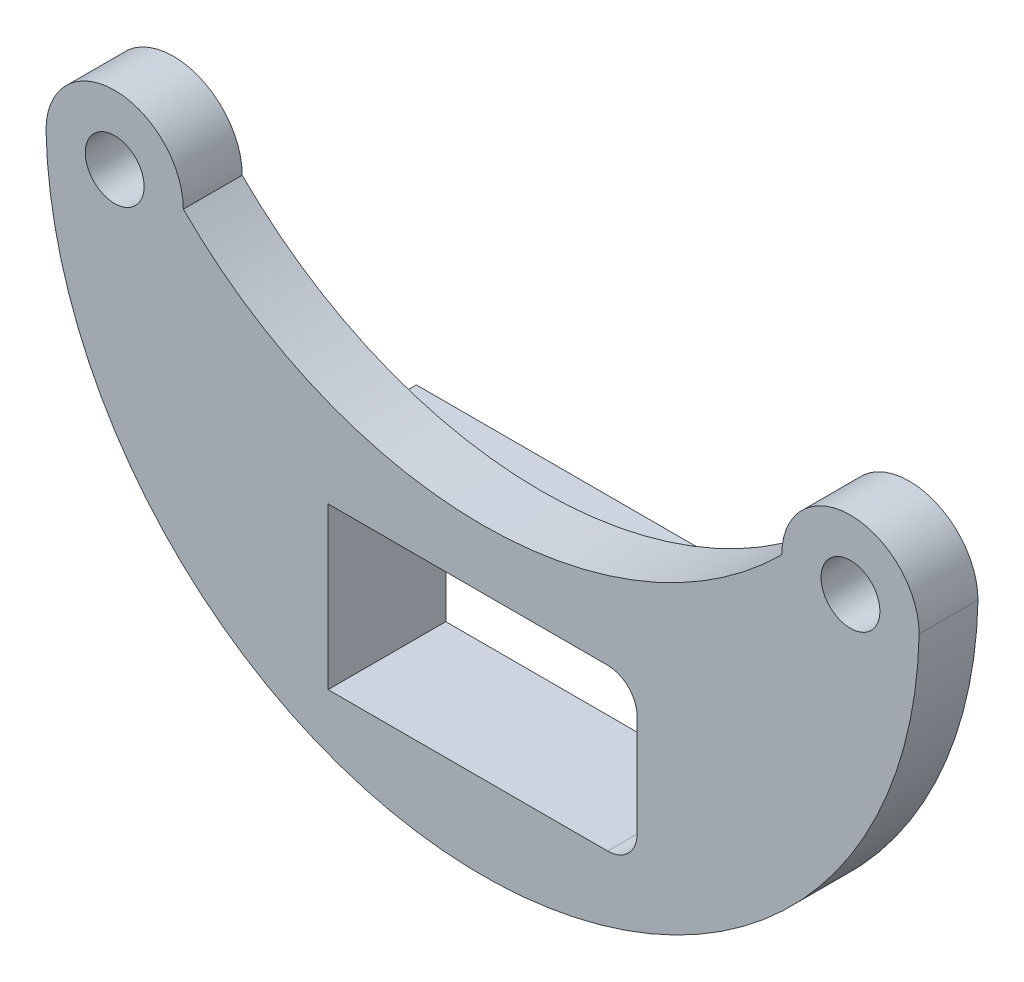
ISO-10303-21;
HEADER;
FILE_DESCRIPTION(('STEP AP214'),'2;1');
FILE_NAME('part.step','',(''),(''),'','','');
FILE_SCHEMA(('AUTOMOTIVE_DESIGN { 1 0 10303 214 1 1 1 1 }'));
ENDSEC;
DATA;
#1=APPLICATION_CONTEXT('core data for automotive mechanical design processes');
#2=APPLICATION_PROTOCOL_DEFINITION('international standard','automotive_design',2000,#1);
#3=PRODUCT_CONTEXT('',#1,'mechanical');
#4=PRODUCT('Part','Part','',(#3));
#5=PRODUCT_RELATED_PRODUCT_CATEGORY('part','',(#4));
#6=PRODUCT_DEFINITION_FORMATION('','',#4);
#7=PRODUCT_DEFINITION_CONTEXT('part definition',#1,'design');
#8=PRODUCT_DEFINITION('design','',#6,#7);
#9=PRODUCT_DEFINITION_SHAPE('','',#8);
#10=(LENGTH_UNIT() NAMED_UNIT(*) SI_UNIT(.MILLI.,.METRE.));
#11=(NAMED_UNIT(*) PLANE_ANGLE_UNIT() SI_UNIT($,.RADIAN.));
#12=(NAMED_UNIT(*) SI_UNIT($,.STERADIAN.) SOLID_ANGLE_UNIT());
#13=UNCERTAINTY_MEASURE_WITH_UNIT(LENGTH_MEASURE(1.E-05),#10,'distance_accuracy_value','');
#14=(GEOMETRIC_REPRESENTATION_CONTEXT(3) GLOBAL_UNCERTAINTY_ASSIGNED_CONTEXT((#13)) GLOBAL_UNIT_ASSIGNED_CONTEXT((#10,
#11,#12)) REPRESENTATION_CONTEXT('',''));
#15=CARTESIAN_POINT('',(0.,0.,0.));
#16=DIRECTION('',(0.,0.,1.));
#17=DIRECTION('',(1.,0.,0.));
#18=AXIS2_PLACEMENT_3D('',#15,#16,#17);
#19=CARTESIAN_POINT('',(0.,0.,0.));
#20=DIRECTION('',(0.,0.,1.));
#21=DIRECTION('',(1.,0.,0.));
#22=AXIS2_PLACEMENT_3D('',#19,#20,#21);
#23=PLANE('',#22);
#24=CARTESIAN_POINT('',(-64.1208968039139,5.45979913379861,0.));
#25=DIRECTION('',(0.,0.,1.));
#26=DIRECTION('',(1.,0.,0.));
#27=AXIS2_PLACEMENT_3D('',#24,#25,#26);
#28=CIRCLE('',#27,3.50000000000002);
#29=CARTESIAN_POINT('',(-60.6208968039139,5.45979913379861,0.));
#30=VERTEX_POINT('',#29);
#31=CARTESIAN_POINT('',(-67.6208968039139,5.45979913379922,0.));
#32=VERTEX_POINT('',#31);
#33=EDGE_CURVE('E239',#30,#32,#28,.T.);
#34=ORIENTED_EDGE('',*,*,#33,.F.);
#35=CARTESIAN_POINT('',(-45.3708968039139,20.7097991337986,0.));
#36=DIRECTION('',(0.,0.,1.));
#37=DIRECTION('',(1.,0.,0.));
#38=AXIS2_PLACEMENT_3D('',#35,#36,#37);
#39=CIRCLE('',#38,21.5667568261897);
#40=CARTESIAN_POINT('',(-30.1208968039139,5.45979913379861,0.));
#41=VERTEX_POINT('',#40);
#42=EDGE_CURVE('E206',#30,#41,#39,.T.);
#43=ORIENTED_EDGE('',*,*,#42,.T.);
#44=CARTESIAN_POINT('',(-26.6208968039139,5.45979913379861,0.));
#45=DIRECTION('',(0.,0.,1.));
#46=DIRECTION('',(1.,0.,0.));
#47=AXIS2_PLACEMENT_3D('',#44,#45,#46);
#48=CIRCLE('',#47,3.5);
#49=CARTESIAN_POINT('',(-23.1208968039139,5.45979913379895,0.));
#50=VERTEX_POINT('',#49);
#51=EDGE_CURVE('E244',#50,#41,#48,.T.);
#52=ORIENTED_EDGE('',*,*,#51,.F.);
#53=CARTESIAN_POINT('',(-45.3708968039139,5.92827762510208,0.));
#54=DIRECTION('',(0.,0.,1.));
#55=DIRECTION('',(1.,0.,0.));
#56=AXIS2_PLACEMENT_3D('',#53,#54,#55);
#57=CIRCLE('',#56,22.2549314107416);
#58=EDGE_CURVE('E242',#32,#50,#57,.T.);
#59=ORIENTED_EDGE('',*,*,#58,.F.);
#60=EDGE_LOOP('',(#34,#43,#52,#59));
#61=FACE_BOUND('',#60,.T.);
#62=CARTESIAN_POINT('',(-26.6208968039139,5.45979913379861,0.));
#63=DIRECTION('',(0.,0.,1.));
#64=DIRECTION('',(1.,0.,0.));
#65=AXIS2_PLACEMENT_3D('',#62,#63,#64);
#66=CIRCLE('',#65,1.5);
#67=CARTESIAN_POINT('',(-25.1208968039139,5.45979913379861,0.));
#68=VERTEX_POINT('',#67);
#69=EDGE_CURVE('E236',#68,#68,#66,.T.);
#70=ORIENTED_EDGE('',*,*,#69,.T.);
#71=EDGE_LOOP('',(#70));
#72=FACE_BOUND('',#71,.T.);
#73=CARTESIAN_POINT('',(-64.1208968039139,5.45979913379861,0.));
#74=DIRECTION('',(0.,0.,1.));
#75=DIRECTION('',(1.,0.,0.));
#76=AXIS2_PLACEMENT_3D('',#73,#74,#75);
#77=CIRCLE('',#76,1.5);
#78=CARTESIAN_POINT('',(-62.6208968039139,5.45979913379861,0.));
#79=VERTEX_POINT('',#78);
#80=EDGE_CURVE('E201',#79,#79,#77,.T.);
#81=ORIENTED_EDGE('',*,*,#80,.T.);
#82=EDGE_LOOP('',(#81));
#83=FACE_BOUND('',#82,.T.);
#84=DIRECTION('',(0.,1.,0.));
#85=VECTOR('',#84,1.);
#86=CARTESIAN_POINT('',(-54.7458968039139,-13.5569576923911,0.));
#87=LINE('',#86,#85);
#88=CARTESIAN_POINT('',(-54.7458968039139,-13.5569576923911,0.));
#89=VERTEX_POINT('',#88);
#90=CARTESIAN_POINT('',(-54.7458968039139,-2.35695769239109,0.));
#91=VERTEX_POINT('',#90);
#92=EDGE_CURVE('E173',#89,#91,#87,.T.);
#93=ORIENTED_EDGE('',*,*,#92,.F.);
#94=DIRECTION('',(-1.,0.,0.));
#95=VECTOR('',#94,1.);
#96=CARTESIAN_POINT('',(-54.7458968039139,-13.5569576923911,0.));
#97=LINE('',#96,#95);
#98=CARTESIAN_POINT('',(-35.9958968039139,-13.5569576923911,0.));
#99=VERTEX_POINT('',#98);
#100=EDGE_CURVE('E178',#99,#89,#97,.T.);
#101=ORIENTED_EDGE('',*,*,#100,.F.);
#102=DIRECTION('',(0.,-1.,0.));
#103=VECTOR('',#102,1.);
#104=CARTESIAN_POINT('',(-35.9958968039139,-13.5569576923911,0.));
#105=LINE('',#104,#103);
#106=CARTESIAN_POINT('',(-35.9958968039139,-2.35695769239109,0.));
#107=VERTEX_POINT('',#106);
#108=EDGE_CURVE('E57',#107,#99,#105,.T.);
#109=ORIENTED_EDGE('',*,*,#108,.F.);
#110=DIRECTION('',(1.,0.,0.));
#111=VECTOR('',#110,1.);
#112=CARTESIAN_POINT('',(-54.7458968039139,-2.35695769239109,0.));
#113=LINE('',#112,#111);
#114=EDGE_CURVE('E52',#91,#107,#113,.T.);
#115=ORIENTED_EDGE('',*,*,#114,.F.);
#116=EDGE_LOOP('',(#93,#101,#109,#115));
#117=FACE_BOUND('',#116,.T.);
#118=ADVANCED_FACE('F35',(#61,#72,#83,#117),#23,.F.);
#119=CARTESIAN_POINT('',(-64.1208968039139,5.45979913379861,3.));
#120=DIRECTION('',(0.,0.,-1.));
#121=DIRECTION('',(-1.,0.,0.));
#122=AXIS2_PLACEMENT_3D('',#119,#120,#121);
#123=CYLINDRICAL_SURFACE('',#122,3.50000000000002);
#124=ORIENTED_EDGE('',*,*,#33,.T.);
#125=DIRECTION('',(0.,0.,-1.));
#126=VECTOR('',#125,1.);
#127=CARTESIAN_POINT('',(-67.6208968039139,5.45979913379922,3.));
#128=LINE('',#127,#126);
#129=CARTESIAN_POINT('',(-67.6208968039139,5.45979913379922,3.));
#130=VERTEX_POINT('',#129);
#131=EDGE_CURVE('E11',#130,#32,#128,.T.);
#132=ORIENTED_EDGE('',*,*,#131,.F.);
#133=CARTESIAN_POINT('',(-64.1208968039139,5.45979913379861,3.));
#134=DIRECTION('',(0.,0.,1.));
#135=DIRECTION('',(1.,0.,0.));
#136=AXIS2_PLACEMENT_3D('',#133,#134,#135);
#137=CIRCLE('',#136,3.50000000000002);
#138=CARTESIAN_POINT('',(-60.6208968039139,5.45979913379861,3.));
#139=VERTEX_POINT('',#138);
#140=EDGE_CURVE('E223',#139,#130,#137,.T.);
#141=ORIENTED_EDGE('',*,*,#140,.F.);
#142=DIRECTION('',(0.,0.,-1.));
#143=VECTOR('',#142,1.);
#144=CARTESIAN_POINT('',(-60.6208968039139,5.45979913379861,3.));
#145=LINE('',#144,#143);
#146=EDGE_CURVE('E249',#139,#30,#145,.T.);
#147=ORIENTED_EDGE('',*,*,#146,.T.);
#148=EDGE_LOOP('',(#124,#132,#141,#147));
#149=FACE_BOUND('',#148,.T.);
#150=ADVANCED_FACE('F283',(#149),#123,.T.);
#151=CARTESIAN_POINT('',(-45.3708968039139,5.92827762510208,3.));
#152=DIRECTION('',(0.,0.,-1.));
#153=DIRECTION('',(-1.,0.,0.));
#154=AXIS2_PLACEMENT_3D('',#151,#152,#153);
#155=CYLINDRICAL_SURFACE('',#154,22.2549314107416);
#156=ORIENTED_EDGE('',*,*,#58,.T.);
#157=DIRECTION('',(0.,0.,-1.));
#158=VECTOR('',#157,1.);
#159=CARTESIAN_POINT('',(-23.1208968039139,5.45979913379895,3.));
#160=LINE('',#159,#158);
#161=CARTESIAN_POINT('',(-23.1208968039139,5.45979913379895,3.));
#162=VERTEX_POINT('',#161);
#163=EDGE_CURVE('E44',#162,#50,#160,.T.);
#164=ORIENTED_EDGE('',*,*,#163,.F.);
#165=CARTESIAN_POINT('',(-45.3708968039139,5.92827762510208,3.));
#166=DIRECTION('',(0.,0.,1.));
#167=DIRECTION('',(1.,0.,0.));
#168=AXIS2_PLACEMENT_3D('',#165,#166,#167);
#169=CIRCLE('',#168,22.2549314107416);
#170=EDGE_CURVE('E226',#130,#162,#169,.T.);
#171=ORIENTED_EDGE('',*,*,#170,.F.);
#172=ORIENTED_EDGE('',*,*,#131,.T.);
#173=EDGE_LOOP('',(#156,#164,#171,#172));
#174=FACE_BOUND('',#173,.T.);
#175=ADVANCED_FACE('F286',(#174),#155,.T.);
#176=CARTESIAN_POINT('',(-26.6208968039139,5.45979913379861,3.));
#177=DIRECTION('',(0.,0.,-1.));
#178=DIRECTION('',(-1.,0.,0.));
#179=AXIS2_PLACEMENT_3D('',#176,#177,#178);
#180=CYLINDRICAL_SURFACE('',#179,3.5);
#181=ORIENTED_EDGE('',*,*,#51,.T.);
#182=DIRECTION('',(0.,0.,-1.));
#183=VECTOR('',#182,1.);
#184=CARTESIAN_POINT('',(-30.1208968039139,5.45979913379861,3.));
#185=LINE('',#184,#183);
#186=CARTESIAN_POINT('',(-30.1208968039139,5.45979913379861,3.));
#187=VERTEX_POINT('',#186);
#188=EDGE_CURVE('E251',#187,#41,#185,.T.);
#189=ORIENTED_EDGE('',*,*,#188,.F.);
#190=CARTESIAN_POINT('',(-26.6208968039139,5.45979913379861,3.));
#191=DIRECTION('',(0.,0.,1.));
#192=DIRECTION('',(1.,0.,0.));
#193=AXIS2_PLACEMENT_3D('',#190,#191,#192);
#194=CIRCLE('',#193,3.5);
#195=EDGE_CURVE('E228',#162,#187,#194,.T.);
#196=ORIENTED_EDGE('',*,*,#195,.F.);
#197=ORIENTED_EDGE('',*,*,#163,.T.);
#198=EDGE_LOOP('',(#181,#189,#196,#197));
#199=FACE_BOUND('',#198,.T.);
#200=ADVANCED_FACE('F291',(#199),#180,.T.);
#201=CARTESIAN_POINT('',(-38.9958968039139,-5.35695769239109,3.));
#202=DIRECTION('',(0.,0.,-1.));
#203=DIRECTION('',(-1.,0.,0.));
#204=AXIS2_PLACEMENT_3D('',#201,#202,#203);
#205=CYLINDRICAL_SURFACE('',#204,1.5);
#206=DIRECTION('',(0.,0.,-1.));
#207=VECTOR('',#206,1.);
#208=CARTESIAN_POINT('',(-38.9958968039139,-3.85695769239109,3.));
#209=LINE('',#208,#207);
#210=CARTESIAN_POINT('',(-38.9958968039139,-3.85695769239109,3.));
#211=VERTEX_POINT('',#210);
#212=CARTESIAN_POINT('',(-38.9958968039139,-3.85695769239109,-3.));
#213=VERTEX_POINT('',#212);
#214=EDGE_CURVE('E233',#211,#213,#209,.T.);
#215=ORIENTED_EDGE('',*,*,#214,.T.);
#216=CARTESIAN_POINT('',(-38.9958968039139,-5.35695769239109,-3.));
#217=DIRECTION('',(0.,0.,-1.));
#218=DIRECTION('',(-1.,0.,0.));
#219=AXIS2_PLACEMENT_3D('',#216,#217,#218);
#220=CIRCLE('',#219,1.5);
#221=CARTESIAN_POINT('',(-37.4958968039139,-5.3569576923911,-3.));
#222=VERTEX_POINT('',#221);
#223=EDGE_CURVE('E168',#213,#222,#220,.T.);
#224=ORIENTED_EDGE('',*,*,#223,.T.);
#225=DIRECTION('',(0.,0.,-1.));
#226=VECTOR('',#225,1.);
#227=CARTESIAN_POINT('',(-37.4958968039139,-5.3569576923911,3.));
#228=LINE('',#227,#226);
#229=CARTESIAN_POINT('',(-37.4958968039139,-5.3569576923911,3.));
#230=VERTEX_POINT('',#229);
#231=EDGE_CURVE('E39',#230,#222,#228,.T.);
#232=ORIENTED_EDGE('',*,*,#231,.F.);
#233=CARTESIAN_POINT('',(-38.9958968039139,-5.35695769239109,3.));
#234=DIRECTION('',(0.,0.,1.));
#235=DIRECTION('',(1.,0.,0.));
#236=AXIS2_PLACEMENT_3D('',#233,#234,#235);
#237=CIRCLE('',#236,1.5);
#238=EDGE_CURVE('E209',#230,#211,#237,.T.);
#239=ORIENTED_EDGE('',*,*,#238,.T.);
#240=EDGE_LOOP('',(#215,#224,#232,#239));
#241=FACE_BOUND('',#240,.T.);
#242=ADVANCED_FACE('F264',(#241),#205,.F.);
#243=CARTESIAN_POINT('',(-37.4958968039139,0.,3.));
#244=DIRECTION('',(1.,0.,0.));
#245=DIRECTION('',(0.,0.,-1.));
#246=AXIS2_PLACEMENT_3D('',#243,#244,#245);
#247=PLANE('',#246);
#248=ORIENTED_EDGE('',*,*,#231,.T.);
#249=DIRECTION('',(0.,-1.,0.));
#250=VECTOR('',#249,1.);
#251=CARTESIAN_POINT('',(-37.4958968039139,-10.5569576923911,-3.));
#252=LINE('',#251,#250);
#253=CARTESIAN_POINT('',(-37.4958968039139,-10.5569576923911,-3.));
#254=VERTEX_POINT('',#253);
#255=EDGE_CURVE('E171',#222,#254,#252,.T.);
#256=ORIENTED_EDGE('',*,*,#255,.T.);
#257=DIRECTION('',(0.,0.,-1.));
#258=VECTOR('',#257,1.);
#259=CARTESIAN_POINT('',(-37.4958968039139,-10.5569576923911,3.));
#260=LINE('',#259,#258);
#261=CARTESIAN_POINT('',(-37.4958968039139,-10.5569576923911,3.));
#262=VERTEX_POINT('',#261);
#263=EDGE_CURVE('E147',#262,#254,#260,.T.);
#264=ORIENTED_EDGE('',*,*,#263,.F.);
#265=DIRECTION('',(0.,-1.,0.));
#266=VECTOR('',#265,1.);
#267=CARTESIAN_POINT('',(-37.4958968039139,0.,3.));
#268=LINE('',#267,#266);
#269=EDGE_CURVE('E212',#230,#262,#268,.T.);
#270=ORIENTED_EDGE('',*,*,#269,.F.);
#271=EDGE_LOOP('',(#248,#256,#264,#270));
#272=FACE_BOUND('',#271,.T.);
#273=ADVANCED_FACE('F260',(#272),#247,.F.);
#274=CARTESIAN_POINT('',(-38.9958968039139,-10.5569576923911,3.));
#275=DIRECTION('',(0.,0.,-1.));
#276=DIRECTION('',(-1.,0.,0.));
#277=AXIS2_PLACEMENT_3D('',#274,#275,#276);
#278=CYLINDRICAL_SURFACE('',#277,1.5);
#279=ORIENTED_EDGE('',*,*,#263,.T.);
#280=CARTESIAN_POINT('',(-38.9958968039139,-10.5569576923911,-3.));
#281=DIRECTION('',(0.,0.,-1.));
#282=DIRECTION('',(-1.,0.,0.));
#283=AXIS2_PLACEMENT_3D('',#280,#281,#282);
#284=CIRCLE('',#283,1.50000000000001);
#285=CARTESIAN_POINT('',(-38.9958968039139,-12.0569576923911,-3.));
#286=VERTEX_POINT('',#285);
#287=EDGE_CURVE('E151',#254,#286,#284,.T.);
#288=ORIENTED_EDGE('',*,*,#287,.T.);
#289=DIRECTION('',(0.,0.,-1.));
#290=VECTOR('',#289,1.);
#291=CARTESIAN_POINT('',(-38.9958968039139,-12.0569576923911,3.));
#292=LINE('',#291,#290);
#293=CARTESIAN_POINT('',(-38.9958968039139,-12.0569576923911,3.));
#294=VERTEX_POINT('',#293);
#295=EDGE_CURVE('E136',#294,#286,#292,.T.);
#296=ORIENTED_EDGE('',*,*,#295,.F.);
#297=CARTESIAN_POINT('',(-38.9958968039139,-10.5569576923911,3.));
#298=DIRECTION('',(0.,0.,1.));
#299=DIRECTION('',(1.,0.,0.));
#300=AXIS2_PLACEMENT_3D('',#297,#298,#299);
#301=CIRCLE('',#300,1.5);
#302=EDGE_CURVE('E215',#262,#294,#301,.F.);
#303=ORIENTED_EDGE('',*,*,#302,.F.);
#304=EDGE_LOOP('',(#279,#288,#296,#303));
#305=FACE_BOUND('',#304,.T.);
#306=ADVANCED_FACE('F152',(#305),#278,.F.);
#307=CARTESIAN_POINT('',(0.,-12.0569576923911,3.));
#308=DIRECTION('',(0.,-1.,0.));
#309=DIRECTION('',(1.,0.,0.));
#310=AXIS2_PLACEMENT_3D('',#307,#308,#309);
#311=PLANE('',#310);
#312=ORIENTED_EDGE('',*,*,#295,.T.);
#313=DIRECTION('',(-1.,0.,0.));
#314=VECTOR('',#313,1.);
#315=CARTESIAN_POINT('',(-38.9958968039139,-12.0569576923911,-3.));
#316=LINE('',#315,#314);
#317=CARTESIAN_POINT('',(-53.2458968039139,-12.0569576923911,-3.));
#318=VERTEX_POINT('',#317);
#319=EDGE_CURVE('E141',#286,#318,#316,.T.);
#320=ORIENTED_EDGE('',*,*,#319,.T.);
#321=DIRECTION('',(0.,0.,-1.));
#322=VECTOR('',#321,1.);
#323=CARTESIAN_POINT('',(-53.2458968039139,-12.0569576923911,3.));
#324=LINE('',#323,#322);
#325=CARTESIAN_POINT('',(-53.2458968039139,-12.0569576923911,3.));
#326=VERTEX_POINT('',#325);
#327=EDGE_CURVE('E148',#326,#318,#324,.T.);
#328=ORIENTED_EDGE('',*,*,#327,.F.);
#329=DIRECTION('',(-1.,0.,0.));
#330=VECTOR('',#329,1.);
#331=CARTESIAN_POINT('',(0.,-12.0569576923911,3.));
#332=LINE('',#331,#330);
#333=EDGE_CURVE('E144',#294,#326,#332,.T.);
#334=ORIENTED_EDGE('',*,*,#333,.F.);
#335=EDGE_LOOP('',(#312,#320,#328,#334));
#336=FACE_BOUND('',#335,.T.);
#337=ADVANCED_FACE('F138',(#336),#311,.F.);
#338=CARTESIAN_POINT('',(-53.2458968039139,0.,3.));
#339=DIRECTION('',(-1.,0.,0.));
#340=DIRECTION('',(0.,0.,1.));
#341=AXIS2_PLACEMENT_3D('',#338,#339,#340);
#342=PLANE('',#341);
#343=ORIENTED_EDGE('',*,*,#327,.T.);
#344=DIRECTION('',(0.,1.,0.));
#345=VECTOR('',#344,1.);
#346=CARTESIAN_POINT('',(-53.2458968039139,-12.0569576923911,-3.));
#347=LINE('',#346,#345);
#348=CARTESIAN_POINT('',(-53.2458968039139,-3.85695769239109,-3.));
#349=VERTEX_POINT('',#348);
#350=EDGE_CURVE('E161',#318,#349,#347,.T.);
#351=ORIENTED_EDGE('',*,*,#350,.T.);
#352=DIRECTION('',(0.,0.,-1.));
#353=VECTOR('',#352,1.);
#354=CARTESIAN_POINT('',(-53.2458968039139,-3.85695769239109,3.));
#355=LINE('',#354,#353);
#356=CARTESIAN_POINT('',(-53.2458968039139,-3.85695769239109,3.));
#357=VERTEX_POINT('',#356);
#358=EDGE_CURVE('E256',#357,#349,#355,.T.);
#359=ORIENTED_EDGE('',*,*,#358,.F.);
#360=DIRECTION('',(0.,1.,0.));
#361=VECTOR('',#360,1.);
#362=CARTESIAN_POINT('',(-53.2458968039139,0.,3.));
#363=LINE('',#362,#361);
#364=EDGE_CURVE('E218',#326,#357,#363,.T.);
#365=ORIENTED_EDGE('',*,*,#364,.F.);
#366=EDGE_LOOP('',(#343,#351,#359,#365));
#367=FACE_BOUND('',#366,.T.);
#368=ADVANCED_FACE('F270',(#367),#342,.F.);
#369=CARTESIAN_POINT('',(0.,-3.85695769239109,3.));
#370=DIRECTION('',(0.,1.,0.));
#371=DIRECTION('',(0.,0.,1.));
#372=AXIS2_PLACEMENT_3D('',#369,#370,#371);
#373=PLANE('',#372);
#374=ORIENTED_EDGE('',*,*,#358,.T.);
#375=DIRECTION('',(1.,0.,0.));
#376=VECTOR('',#375,1.);
#377=CARTESIAN_POINT('',(-53.2458968039139,-3.85695769239109,-3.));
#378=LINE('',#377,#376);
#379=EDGE_CURVE('E163',#349,#213,#378,.T.);
#380=ORIENTED_EDGE('',*,*,#379,.T.);
#381=ORIENTED_EDGE('',*,*,#214,.F.);
#382=DIRECTION('',(1.,0.,0.));
#383=VECTOR('',#382,1.);
#384=CARTESIAN_POINT('',(0.,-3.85695769239109,3.));
#385=LINE('',#384,#383);
#386=EDGE_CURVE('E221',#357,#211,#385,.T.);
#387=ORIENTED_EDGE('',*,*,#386,.F.);
#388=EDGE_LOOP('',(#374,#380,#381,#387));
#389=FACE_BOUND('',#388,.T.);
#390=ADVANCED_FACE('F267',(#389),#373,.F.);
#391=CARTESIAN_POINT('',(-26.6208968039139,5.45979913379861,3.));
#392=DIRECTION('',(0.,0.,-1.));
#393=DIRECTION('',(-1.,0.,0.));
#394=AXIS2_PLACEMENT_3D('',#391,#392,#393);
#395=CYLINDRICAL_SURFACE('',#394,1.5);
#396=CARTESIAN_POINT('',(-26.6208968039139,5.45979913379861,3.));
#397=DIRECTION('',(0.,0.,1.));
#398=DIRECTION('',(1.,0.,0.));
#399=AXIS2_PLACEMENT_3D('',#396,#397,#398);
#400=CIRCLE('',#399,1.5);
#401=CARTESIAN_POINT('',(-25.1208968039139,5.45979913379861,3.));
#402=VERTEX_POINT('',#401);
#403=EDGE_CURVE('E205',#402,#402,#400,.T.);
#404=ORIENTED_EDGE('',*,*,#403,.T.);
#405=EDGE_LOOP('',(#404));
#406=FACE_BOUND('',#405,.T.);
#407=ORIENTED_EDGE('',*,*,#69,.F.);
#408=EDGE_LOOP('',(#407));
#409=FACE_BOUND('',#408,.T.);
#410=ADVANCED_FACE('F337',(#406,#409),#395,.F.);
#411=CARTESIAN_POINT('',(-64.1208968039139,5.45979913379861,3.));
#412=DIRECTION('',(0.,0.,-1.));
#413=DIRECTION('',(-1.,0.,0.));
#414=AXIS2_PLACEMENT_3D('',#411,#412,#413);
#415=CYLINDRICAL_SURFACE('',#414,1.5);
#416=CARTESIAN_POINT('',(-64.1208968039139,5.45979913379861,3.));
#417=DIRECTION('',(0.,0.,1.));
#418=DIRECTION('',(1.,0.,0.));
#419=AXIS2_PLACEMENT_3D('',#416,#417,#418);
#420=CIRCLE('',#419,1.5);
#421=CARTESIAN_POINT('',(-62.6208968039139,5.45979913379861,3.));
#422=VERTEX_POINT('',#421);
#423=EDGE_CURVE('E202',#422,#422,#420,.T.);
#424=ORIENTED_EDGE('',*,*,#423,.T.);
#425=EDGE_LOOP('',(#424));
#426=FACE_BOUND('',#425,.T.);
#427=ORIENTED_EDGE('',*,*,#80,.F.);
#428=EDGE_LOOP('',(#427));
#429=FACE_BOUND('',#428,.T.);
#430=ADVANCED_FACE('F37',(#426,#429),#415,.F.);
#431=CARTESIAN_POINT('',(-45.3708968039139,20.7097991337986,3.));
#432=DIRECTION('',(0.,0.,-1.));
#433=DIRECTION('',(-1.,0.,0.));
#434=AXIS2_PLACEMENT_3D('',#431,#432,#433);
#435=CYLINDRICAL_SURFACE('',#434,21.5667568261897);
#436=ORIENTED_EDGE('',*,*,#42,.F.);
#437=ORIENTED_EDGE('',*,*,#146,.F.);
#438=CARTESIAN_POINT('',(-45.3708968039139,20.7097991337986,3.));
#439=DIRECTION('',(0.,0.,1.));
#440=DIRECTION('',(1.,0.,0.));
#441=AXIS2_PLACEMENT_3D('',#438,#439,#440);
#442=CIRCLE('',#441,21.5667568261897);
#443=EDGE_CURVE('E230',#139,#187,#442,.T.);
#444=ORIENTED_EDGE('',*,*,#443,.T.);
#445=ORIENTED_EDGE('',*,*,#188,.T.);
#446=EDGE_LOOP('',(#436,#437,#444,#445));
#447=FACE_BOUND('',#446,.T.);
#448=ADVANCED_FACE('F275',(#447),#435,.F.);
#449=CARTESIAN_POINT('',(0.,0.,3.));
#450=DIRECTION('',(0.,0.,1.));
#451=DIRECTION('',(1.,0.,0.));
#452=AXIS2_PLACEMENT_3D('',#449,#450,#451);
#453=PLANE('',#452);
#454=ORIENTED_EDGE('',*,*,#423,.F.);
#455=EDGE_LOOP('',(#454));
#456=FACE_BOUND('',#455,.T.);
#457=ORIENTED_EDGE('',*,*,#403,.F.);
#458=EDGE_LOOP('',(#457));
#459=FACE_BOUND('',#458,.T.);
#460=ORIENTED_EDGE('',*,*,#238,.F.);
#461=ORIENTED_EDGE('',*,*,#269,.T.);
#462=ORIENTED_EDGE('',*,*,#302,.T.);
#463=ORIENTED_EDGE('',*,*,#333,.T.);
#464=ORIENTED_EDGE('',*,*,#364,.T.);
#465=ORIENTED_EDGE('',*,*,#386,.T.);
#466=EDGE_LOOP('',(#460,#461,#462,#463,#464,#465));
#467=FACE_BOUND('',#466,.T.);
#468=ORIENTED_EDGE('',*,*,#140,.T.);
#469=ORIENTED_EDGE('',*,*,#170,.T.);
#470=ORIENTED_EDGE('',*,*,#195,.T.);
#471=ORIENTED_EDGE('',*,*,#443,.F.);
#472=EDGE_LOOP('',(#468,#469,#470,#471));
#473=FACE_BOUND('',#472,.T.);
#474=ADVANCED_FACE('F272',(#456,#459,#467,#473),#453,.T.);
#475=CARTESIAN_POINT('',(0.,0.,-3.));
#476=DIRECTION('',(0.,0.,-1.));
#477=DIRECTION('',(-1.,0.,0.));
#478=AXIS2_PLACEMENT_3D('',#475,#476,#477);
#479=PLANE('',#478);
#480=DIRECTION('',(0.,1.,0.));
#481=VECTOR('',#480,1.);
#482=CARTESIAN_POINT('',(-54.7458968039139,-13.5569576923911,-3.));
#483=LINE('',#482,#481);
#484=CARTESIAN_POINT('',(-54.7458968039139,-13.5569576923911,-3.));
#485=VERTEX_POINT('',#484);
#486=CARTESIAN_POINT('',(-54.7458968039139,-2.35695769239109,-3.));
#487=VERTEX_POINT('',#486);
#488=EDGE_CURVE('E174',#485,#487,#483,.T.);
#489=ORIENTED_EDGE('',*,*,#488,.T.);
#490=DIRECTION('',(1.,0.,0.));
#491=VECTOR('',#490,1.);
#492=CARTESIAN_POINT('',(-54.7458968039139,-2.35695769239109,-3.));
#493=LINE('',#492,#491);
#494=CARTESIAN_POINT('',(-35.9958968039139,-2.35695769239109,-3.));
#495=VERTEX_POINT('',#494);
#496=EDGE_CURVE('E177',#487,#495,#493,.T.);
#497=ORIENTED_EDGE('',*,*,#496,.T.);
#498=DIRECTION('',(0.,-1.,0.));
#499=VECTOR('',#498,1.);
#500=CARTESIAN_POINT('',(-35.9958968039139,-13.5569576923911,-3.));
#501=LINE('',#500,#499);
#502=CARTESIAN_POINT('',(-35.9958968039139,-13.5569576923911,-3.));
#503=VERTEX_POINT('',#502);
#504=EDGE_CURVE('E180',#495,#503,#501,.T.);
#505=ORIENTED_EDGE('',*,*,#504,.T.);
#506=DIRECTION('',(-1.,0.,0.));
#507=VECTOR('',#506,1.);
#508=CARTESIAN_POINT('',(-54.7458968039139,-13.5569576923911,-3.));
#509=LINE('',#508,#507);
#510=EDGE_CURVE('E182',#503,#485,#509,.T.);
#511=ORIENTED_EDGE('',*,*,#510,.T.);
#512=EDGE_LOOP('',(#489,#497,#505,#511));
#513=FACE_BOUND('',#512,.T.);
#514=ORIENTED_EDGE('',*,*,#319,.F.);
#515=ORIENTED_EDGE('',*,*,#287,.F.);
#516=ORIENTED_EDGE('',*,*,#255,.F.);
#517=ORIENTED_EDGE('',*,*,#223,.F.);
#518=ORIENTED_EDGE('',*,*,#379,.F.);
#519=ORIENTED_EDGE('',*,*,#350,.F.);
#520=EDGE_LOOP('',(#514,#515,#516,#517,#518,#519));
#521=FACE_BOUND('',#520,.T.);
#522=ADVANCED_FACE('F158',(#513,#521),#479,.T.);
#523=CARTESIAN_POINT('',(-54.7458968039139,-13.5569576923911,-3.));
#524=DIRECTION('',(1.,0.,0.));
#525=DIRECTION('',(0.,0.,-1.));
#526=AXIS2_PLACEMENT_3D('',#523,#524,#525);
#527=PLANE('',#526);
#528=ORIENTED_EDGE('',*,*,#92,.T.);
#529=DIRECTION('',(0.,0.,1.));
#530=VECTOR('',#529,1.);
#531=CARTESIAN_POINT('',(-54.7458968039139,-2.35695769239109,-3.));
#532=LINE('',#531,#530);
#533=EDGE_CURVE('E199',#487,#91,#532,.T.);
#534=ORIENTED_EDGE('',*,*,#533,.F.);
#535=ORIENTED_EDGE('',*,*,#488,.F.);
#536=DIRECTION('',(0.,0.,1.));
#537=VECTOR('',#536,1.);
#538=CARTESIAN_POINT('',(-54.7458968039139,-13.5569576923911,-3.));
#539=LINE('',#538,#537);
#540=EDGE_CURVE('E184',#485,#89,#539,.T.);
#541=ORIENTED_EDGE('',*,*,#540,.T.);
#542=EDGE_LOOP('',(#528,#534,#535,#541));
#543=FACE_BOUND('',#542,.T.);
#544=ADVANCED_FACE('F309',(#543),#527,.F.);
#545=CARTESIAN_POINT('',(-54.7458968039139,-2.35695769239109,-3.));
#546=DIRECTION('',(0.,-1.,0.));
#547=DIRECTION('',(1.,0.,0.));
#548=AXIS2_PLACEMENT_3D('',#545,#546,#547);
#549=PLANE('',#548);
#550=ORIENTED_EDGE('',*,*,#114,.T.);
#551=DIRECTION('',(0.,0.,1.));
#552=VECTOR('',#551,1.);
#553=CARTESIAN_POINT('',(-35.9958968039139,-2.35695769239109,-3.));
#554=LINE('',#553,#552);
#555=EDGE_CURVE('E196',#495,#107,#554,.T.);
#556=ORIENTED_EDGE('',*,*,#555,.F.);
#557=ORIENTED_EDGE('',*,*,#496,.F.);
#558=ORIENTED_EDGE('',*,*,#533,.T.);
#559=EDGE_LOOP('',(#550,#556,#557,#558));
#560=FACE_BOUND('',#559,.T.);
#561=ADVANCED_FACE('F316',(#560),#549,.F.);
#562=CARTESIAN_POINT('',(-35.9958968039139,-13.5569576923911,-3.));
#563=DIRECTION('',(-1.,0.,0.));
#564=DIRECTION('',(0.,0.,1.));
#565=AXIS2_PLACEMENT_3D('',#562,#563,#564);
#566=PLANE('',#565);
#567=ORIENTED_EDGE('',*,*,#108,.T.);
#568=DIRECTION('',(0.,0.,1.));
#569=VECTOR('',#568,1.);
#570=CARTESIAN_POINT('',(-35.9958968039139,-13.5569576923911,-3.));
#571=LINE('',#570,#569);
#572=EDGE_CURVE('E193',#503,#99,#571,.T.);
#573=ORIENTED_EDGE('',*,*,#572,.F.);
#574=ORIENTED_EDGE('',*,*,#504,.F.);
#575=ORIENTED_EDGE('',*,*,#555,.T.);
#576=EDGE_LOOP('',(#567,#573,#574,#575));
#577=FACE_BOUND('',#576,.T.);
#578=ADVANCED_FACE('F314',(#577),#566,.F.);
#579=CARTESIAN_POINT('',(-54.7458968039139,-13.5569576923911,-3.));
#580=DIRECTION('',(0.,1.,0.));
#581=DIRECTION('',(-1.,0.,0.));
#582=AXIS2_PLACEMENT_3D('',#579,#580,#581);
#583=PLANE('',#582);
#584=ORIENTED_EDGE('',*,*,#100,.T.);
#585=ORIENTED_EDGE('',*,*,#540,.F.);
#586=ORIENTED_EDGE('',*,*,#510,.F.);
#587=ORIENTED_EDGE('',*,*,#572,.T.);
#588=EDGE_LOOP('',(#584,#585,#586,#587));
#589=FACE_BOUND('',#588,.T.);
#590=ADVANCED_FACE('F305',(#589),#583,.F.);
#591=CLOSED_SHELL('',(#118,#150,#175,#200,#242,#273,#306,#337,#368,#390,#410,#430,#448,#474,
#522,#544,#561,#578,#590));
#592=MANIFOLD_SOLID_BREP('B2',#591);
#593=ADVANCED_BREP_SHAPE_REPRESENTATION('',(#18,#592),#14);
#594=SHAPE_DEFINITION_REPRESENTATION(#9,#593);
ENDSEC;
END-ISO-10303-21;
